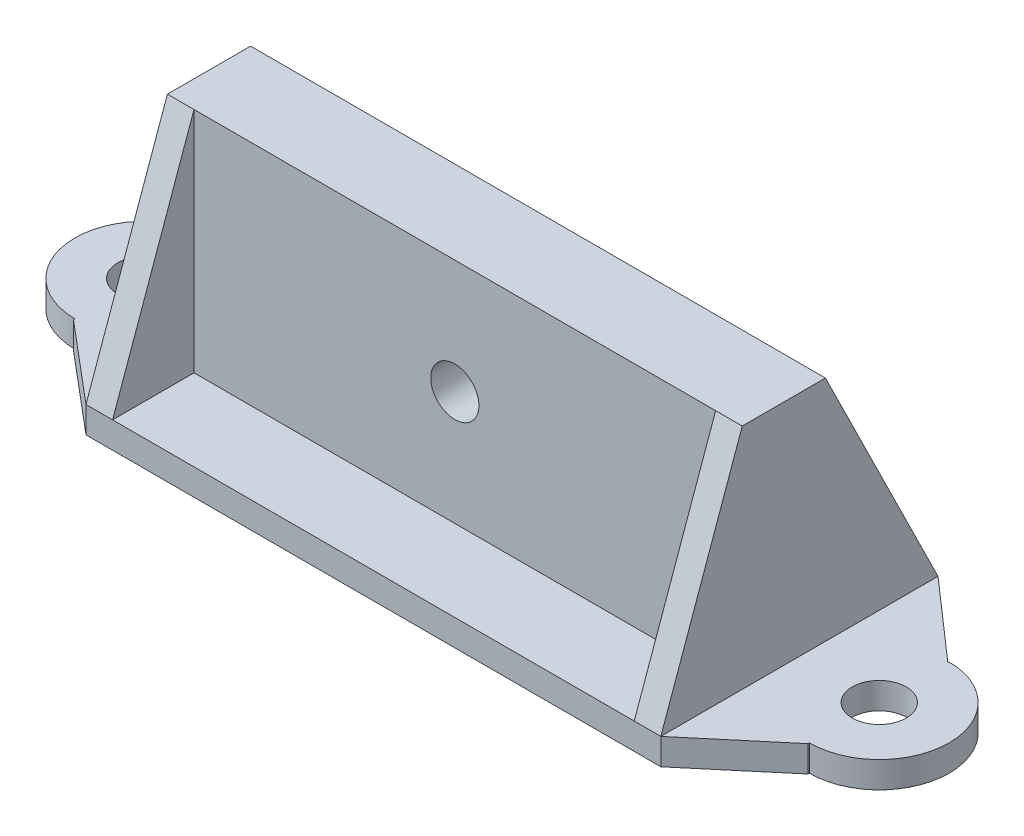
ISO-10303-21;
HEADER;
FILE_DESCRIPTION(('STEP AP214'),'2;1');
FILE_NAME('part.step','',(''),(''),'','','');
FILE_SCHEMA(('AUTOMOTIVE_DESIGN { 1 0 10303 214 1 1 1 1 }'));
ENDSEC;
DATA;
#1=APPLICATION_CONTEXT('core data for automotive mechanical design processes');
#2=APPLICATION_PROTOCOL_DEFINITION('international standard','automotive_design',2000,#1);
#3=PRODUCT_CONTEXT('',#1,'mechanical');
#4=PRODUCT('Part','Part','',(#3));
#5=PRODUCT_RELATED_PRODUCT_CATEGORY('part','',(#4));
#6=PRODUCT_DEFINITION_FORMATION('','',#4);
#7=PRODUCT_DEFINITION_CONTEXT('part definition',#1,'design');
#8=PRODUCT_DEFINITION('design','',#6,#7);
#9=PRODUCT_DEFINITION_SHAPE('','',#8);
#10=(LENGTH_UNIT() NAMED_UNIT(*) SI_UNIT(.MILLI.,.METRE.));
#11=(NAMED_UNIT(*) PLANE_ANGLE_UNIT() SI_UNIT($,.RADIAN.));
#12=(NAMED_UNIT(*) SI_UNIT($,.STERADIAN.) SOLID_ANGLE_UNIT());
#13=UNCERTAINTY_MEASURE_WITH_UNIT(LENGTH_MEASURE(1.E-05),#10,'distance_accuracy_value','');
#14=(GEOMETRIC_REPRESENTATION_CONTEXT(3) GLOBAL_UNCERTAINTY_ASSIGNED_CONTEXT((#13)) GLOBAL_UNIT_ASSIGNED_CONTEXT((#10,
#11,#12)) REPRESENTATION_CONTEXT('',''));
#15=CARTESIAN_POINT('',(0.,0.,0.));
#16=DIRECTION('',(0.,0.,1.));
#17=DIRECTION('',(1.,0.,0.));
#18=AXIS2_PLACEMENT_3D('',#15,#16,#17);
#19=CARTESIAN_POINT('',(41.475,0.,0.));
#20=DIRECTION('',(1.,0.,0.));
#21=DIRECTION('',(0.,0.,-1.));
#22=AXIS2_PLACEMENT_3D('',#19,#20,#21);
#23=PLANE('',#22);
#24=DIRECTION('',(0.,-0.941774279020095,0.33624575443592));
#25=VECTOR('',#24,1.);
#26=CARTESIAN_POINT('',(41.475,16.455,3.82));
#27=LINE('',#26,#25);
#28=CARTESIAN_POINT('',(41.475,16.455,3.82));
#29=VERTEX_POINT('',#28);
#30=CARTESIAN_POINT('',(41.475,-16.455,15.57));
#31=VERTEX_POINT('',#30);
#32=EDGE_CURVE('E358',#29,#31,#27,.T.);
#33=ORIENTED_EDGE('',*,*,#32,.T.);
#34=DIRECTION('',(0.,0.,-1.));
#35=VECTOR('',#34,1.);
#36=CARTESIAN_POINT('',(41.475,-16.455,15.57));
#37=LINE('',#36,#35);
#38=CARTESIAN_POINT('',(41.475,-16.455,-24.43));
#39=VERTEX_POINT('',#38);
#40=EDGE_CURVE('E263',#31,#39,#37,.T.);
#41=ORIENTED_EDGE('',*,*,#40,.T.);
#42=DIRECTION('',(0.,0.896650162821132,0.442739749190015));
#43=VECTOR('',#42,1.);
#44=CARTESIAN_POINT('',(41.475,16.455,-8.18));
#45=LINE('',#44,#43);
#46=CARTESIAN_POINT('',(41.475,16.455,-8.18));
#47=VERTEX_POINT('',#46);
#48=EDGE_CURVE('E299',#39,#47,#45,.T.);
#49=ORIENTED_EDGE('',*,*,#48,.T.);
#50=DIRECTION('',(0.,0.,1.));
#51=VECTOR('',#50,1.);
#52=CARTESIAN_POINT('',(41.475,16.455,0.));
#53=LINE('',#52,#51);
#54=EDGE_CURVE('E356',#47,#29,#53,.T.);
#55=ORIENTED_EDGE('',*,*,#54,.T.);
#56=EDGE_LOOP('',(#33,#41,#49,#55));
#57=FACE_BOUND('',#56,.T.);
#58=ADVANCED_FACE('F43',(#57),#23,.T.);
#59=CARTESIAN_POINT('',(0.,-16.455,0.));
#60=DIRECTION('',(0.,1.,0.));
#61=DIRECTION('',(0.,0.,1.));
#62=AXIS2_PLACEMENT_3D('',#59,#60,#61);
#63=PLANE('',#62);
#64=DIRECTION('',(1.,0.,0.));
#65=VECTOR('',#64,1.);
#66=CARTESIAN_POINT('',(41.475,-16.455,-24.43));
#67=LINE('',#66,#65);
#68=CARTESIAN_POINT('',(-37.635,-16.455,-24.43));
#69=VERTEX_POINT('',#68);
#70=CARTESIAN_POINT('',(37.635,-16.455,-24.43));
#71=VERTEX_POINT('',#70);
#72=EDGE_CURVE('E325',#69,#71,#67,.T.);
#73=ORIENTED_EDGE('',*,*,#72,.F.);
#74=DIRECTION('',(0.,0.,1.));
#75=VECTOR('',#74,1.);
#76=CARTESIAN_POINT('',(-37.635,-16.455,0.));
#77=LINE('',#76,#75);
#78=CARTESIAN_POINT('',(-37.635,-16.455,-8.18));
#79=VERTEX_POINT('',#78);
#80=EDGE_CURVE('E296',#69,#79,#77,.T.);
#81=ORIENTED_EDGE('',*,*,#80,.T.);
#82=DIRECTION('',(-1.,0.,0.));
#83=VECTOR('',#82,1.);
#84=CARTESIAN_POINT('',(0.,-16.455,-8.18));
#85=LINE('',#84,#83);
#86=CARTESIAN_POINT('',(37.635,-16.455,-8.18));
#87=VERTEX_POINT('',#86);
#88=EDGE_CURVE('E11',#87,#79,#85,.T.);
#89=ORIENTED_EDGE('',*,*,#88,.F.);
#90=DIRECTION('',(0.,0.,-1.));
#91=VECTOR('',#90,1.);
#92=CARTESIAN_POINT('',(37.635,-16.455,-24.43));
#93=LINE('',#92,#91);
#94=EDGE_CURVE('E303',#87,#71,#93,.T.);
#95=ORIENTED_EDGE('',*,*,#94,.T.);
#96=EDGE_LOOP('',(#73,#81,#89,#95));
#97=FACE_BOUND('',#96,.T.);
#98=ADVANCED_FACE('F441',(#97),#63,.T.);
#99=CARTESIAN_POINT('',(-41.475,-17.345,-8.18));
#100=DIRECTION('',(0.,0.,-1.));
#101=DIRECTION('',(-1.,0.,0.));
#102=AXIS2_PLACEMENT_3D('',#99,#100,#101);
#103=PLANE('',#102);
#104=CARTESIAN_POINT('',(0.,0.,-8.18));
#105=DIRECTION('',(0.,0.,-1.));
#106=DIRECTION('',(-1.,0.,0.));
#107=AXIS2_PLACEMENT_3D('',#104,#105,#106);
#108=CIRCLE('',#107,3.475);
#109=CARTESIAN_POINT('',(-3.475,0.,-8.18));
#110=VERTEX_POINT('',#109);
#111=EDGE_CURVE('E47',#110,#110,#108,.T.);
#112=ORIENTED_EDGE('',*,*,#111,.F.);
#113=EDGE_LOOP('',(#112));
#114=FACE_BOUND('',#113,.T.);
#115=ORIENTED_EDGE('',*,*,#88,.T.);
#116=DIRECTION('',(0.,1.,0.));
#117=VECTOR('',#116,1.);
#118=CARTESIAN_POINT('',(-37.635,16.455,-8.18));
#119=LINE('',#118,#117);
#120=CARTESIAN_POINT('',(-37.635,16.455,-8.18));
#121=VERTEX_POINT('',#120);
#122=EDGE_CURVE('E288',#79,#121,#119,.T.);
#123=ORIENTED_EDGE('',*,*,#122,.T.);
#124=DIRECTION('',(-1.,0.,0.));
#125=VECTOR('',#124,1.);
#126=CARTESIAN_POINT('',(-41.475,16.455,-8.18));
#127=LINE('',#126,#125);
#128=CARTESIAN_POINT('',(37.635,16.455,-8.18));
#129=VERTEX_POINT('',#128);
#130=EDGE_CURVE('E320',#129,#121,#127,.T.);
#131=ORIENTED_EDGE('',*,*,#130,.F.);
#132=DIRECTION('',(0.,-1.,0.));
#133=VECTOR('',#132,1.);
#134=CARTESIAN_POINT('',(37.635,-16.455,-8.18));
#135=LINE('',#134,#133);
#136=EDGE_CURVE('E300',#129,#87,#135,.T.);
#137=ORIENTED_EDGE('',*,*,#136,.T.);
#138=EDGE_LOOP('',(#115,#123,#131,#137));
#139=FACE_BOUND('',#138,.T.);
#140=ADVANCED_FACE('F432',(#114,#139),#103,.T.);
#141=CARTESIAN_POINT('',(-37.635,16.455,3.82));
#142=DIRECTION('',(0.,-1.,0.));
#143=DIRECTION('',(0.,0.,-1.));
#144=AXIS2_PLACEMENT_3D('',#141,#142,#143);
#145=PLANE('',#144);
#146=ORIENTED_EDGE('',*,*,#54,.F.);
#147=EDGE_CURVE('E316',#47,#129,#127,.T.);
#148=ORIENTED_EDGE('',*,*,#147,.T.);
#149=ORIENTED_EDGE('',*,*,#130,.T.);
#150=DIRECTION('',(-1.,0.,0.));
#151=VECTOR('',#150,1.);
#152=CARTESIAN_POINT('',(-37.635,16.455,-8.18));
#153=LINE('',#152,#151);
#154=CARTESIAN_POINT('',(-41.475,16.455,-8.18));
#155=VERTEX_POINT('',#154);
#156=EDGE_CURVE('E291',#121,#155,#153,.T.);
#157=ORIENTED_EDGE('',*,*,#156,.T.);
#158=DIRECTION('',(0.,0.,-1.));
#159=VECTOR('',#158,1.);
#160=CARTESIAN_POINT('',(-41.475,16.455,0.));
#161=LINE('',#160,#159);
#162=CARTESIAN_POINT('',(-41.475,16.455,3.82));
#163=VERTEX_POINT('',#162);
#164=EDGE_CURVE('E344',#163,#155,#161,.T.);
#165=ORIENTED_EDGE('',*,*,#164,.F.);
#166=DIRECTION('',(1.,0.,0.));
#167=VECTOR('',#166,1.);
#168=CARTESIAN_POINT('',(-41.475,16.455,3.82));
#169=LINE('',#168,#167);
#170=CARTESIAN_POINT('',(-37.635,16.455,3.82));
#171=VERTEX_POINT('',#170);
#172=EDGE_CURVE('E347',#163,#171,#169,.T.);
#173=ORIENTED_EDGE('',*,*,#172,.T.);
#174=DIRECTION('',(-1.,0.,0.));
#175=VECTOR('',#174,1.);
#176=CARTESIAN_POINT('',(-37.635,16.455,3.82));
#177=LINE('',#176,#175);
#178=CARTESIAN_POINT('',(37.635,16.455,3.82));
#179=VERTEX_POINT('',#178);
#180=EDGE_CURVE('E375',#179,#171,#177,.T.);
#181=ORIENTED_EDGE('',*,*,#180,.F.);
#182=DIRECTION('',(-1.,0.,0.));
#183=VECTOR('',#182,1.);
#184=CARTESIAN_POINT('',(41.475,16.455,3.82));
#185=LINE('',#184,#183);
#186=EDGE_CURVE('E369',#29,#179,#185,.T.);
#187=ORIENTED_EDGE('',*,*,#186,.F.);
#188=EDGE_LOOP('',(#146,#148,#149,#157,#165,#173,#181,#187));
#189=FACE_BOUND('',#188,.T.);
#190=ADVANCED_FACE('F45',(#189),#145,.F.);
#191=CARTESIAN_POINT('',(0.,0.,3.82));
#192=DIRECTION('',(0.,0.,-1.));
#193=DIRECTION('',(-1.,0.,0.));
#194=AXIS2_PLACEMENT_3D('',#191,#192,#193);
#195=PLANE('',#194);
#196=CARTESIAN_POINT('',(0.,0.,3.82));
#197=DIRECTION('',(0.,0.,1.));
#198=DIRECTION('',(1.,0.,0.));
#199=AXIS2_PLACEMENT_3D('',#196,#197,#198);
#200=CIRCLE('',#199,3.475);
#201=CARTESIAN_POINT('',(3.475,0.,3.82));
#202=VERTEX_POINT('',#201);
#203=EDGE_CURVE('E313',#202,#202,#200,.T.);
#204=ORIENTED_EDGE('',*,*,#203,.F.);
#205=EDGE_LOOP('',(#204));
#206=FACE_BOUND('',#205,.T.);
#207=DIRECTION('',(0.,1.,0.));
#208=VECTOR('',#207,1.);
#209=CARTESIAN_POINT('',(37.635,-16.455,3.82));
#210=LINE('',#209,#208);
#211=CARTESIAN_POINT('',(37.635,-16.455,3.82));
#212=VERTEX_POINT('',#211);
#213=EDGE_CURVE('E372',#212,#179,#210,.T.);
#214=ORIENTED_EDGE('',*,*,#213,.T.);
#215=ORIENTED_EDGE('',*,*,#180,.T.);
#216=DIRECTION('',(0.,-1.,0.));
#217=VECTOR('',#216,1.);
#218=CARTESIAN_POINT('',(-37.635,-16.455,3.82));
#219=LINE('',#218,#217);
#220=CARTESIAN_POINT('',(-37.635,-16.455,3.82));
#221=VERTEX_POINT('',#220);
#222=EDGE_CURVE('E378',#171,#221,#219,.T.);
#223=ORIENTED_EDGE('',*,*,#222,.T.);
#224=DIRECTION('',(1.,0.,0.));
#225=VECTOR('',#224,1.);
#226=CARTESIAN_POINT('',(-37.635,-16.455,3.82));
#227=LINE('',#226,#225);
#228=EDGE_CURVE('E52',#221,#212,#227,.T.);
#229=ORIENTED_EDGE('',*,*,#228,.T.);
#230=EDGE_LOOP('',(#214,#215,#223,#229));
#231=FACE_BOUND('',#230,.T.);
#232=ADVANCED_FACE('F383',(#206,#231),#195,.F.);
#233=CARTESIAN_POINT('',(41.475,16.455,3.82));
#234=DIRECTION('',(0.,-0.33624575443592,-0.941774279020095));
#235=DIRECTION('',(0.,0.941774279020095,-0.33624575443592));
#236=AXIS2_PLACEMENT_3D('',#233,#234,#235);
#237=PLANE('',#236);
#238=DIRECTION('',(0.,-0.941774279020095,0.33624575443592));
#239=VECTOR('',#238,1.);
#240=CARTESIAN_POINT('',(37.635,16.455,3.82));
#241=LINE('',#240,#239);
#242=CARTESIAN_POINT('',(37.635,-16.455,15.57));
#243=VERTEX_POINT('',#242);
#244=EDGE_CURVE('E359',#179,#243,#241,.T.);
#245=ORIENTED_EDGE('',*,*,#244,.T.);
#246=DIRECTION('',(-1.,0.,0.));
#247=VECTOR('',#246,1.);
#248=CARTESIAN_POINT('',(41.475,-16.455,15.57));
#249=LINE('',#248,#247);
#250=EDGE_CURVE('E362',#31,#243,#249,.T.);
#251=ORIENTED_EDGE('',*,*,#250,.F.);
#252=ORIENTED_EDGE('',*,*,#32,.F.);
#253=ORIENTED_EDGE('',*,*,#186,.T.);
#254=EDGE_LOOP('',(#245,#251,#252,#253));
#255=FACE_BOUND('',#254,.T.);
#256=ADVANCED_FACE('F391',(#255),#237,.F.);
#257=CARTESIAN_POINT('',(37.635,0.,0.));
#258=DIRECTION('',(1.,0.,0.));
#259=DIRECTION('',(0.,0.,-1.));
#260=AXIS2_PLACEMENT_3D('',#257,#258,#259);
#261=PLANE('',#260);
#262=ORIENTED_EDGE('',*,*,#213,.F.);
#263=DIRECTION('',(0.,0.,-1.));
#264=VECTOR('',#263,1.);
#265=CARTESIAN_POINT('',(37.635,-16.455,3.82));
#266=LINE('',#265,#264);
#267=EDGE_CURVE('E355',#243,#212,#266,.T.);
#268=ORIENTED_EDGE('',*,*,#267,.F.);
#269=ORIENTED_EDGE('',*,*,#244,.F.);
#270=EDGE_LOOP('',(#262,#268,#269));
#271=FACE_BOUND('',#270,.T.);
#272=ADVANCED_FACE('F388',(#271),#261,.F.);
#273=CARTESIAN_POINT('',(-37.635,0.,0.));
#274=DIRECTION('',(1.,0.,0.));
#275=DIRECTION('',(0.,0.,-1.));
#276=AXIS2_PLACEMENT_3D('',#273,#274,#275);
#277=PLANE('',#276);
#278=ORIENTED_EDGE('',*,*,#222,.F.);
#279=DIRECTION('',(0.,0.941774279020095,-0.33624575443592));
#280=VECTOR('',#279,1.);
#281=CARTESIAN_POINT('',(-37.635,16.455,3.82));
#282=LINE('',#281,#280);
#283=CARTESIAN_POINT('',(-37.635,-16.455,15.57));
#284=VERTEX_POINT('',#283);
#285=EDGE_CURVE('E341',#284,#171,#282,.T.);
#286=ORIENTED_EDGE('',*,*,#285,.F.);
#287=DIRECTION('',(0.,0.,1.));
#288=VECTOR('',#287,1.);
#289=CARTESIAN_POINT('',(-37.635,-16.455,3.82));
#290=LINE('',#289,#288);
#291=EDGE_CURVE('E67',#221,#284,#290,.T.);
#292=ORIENTED_EDGE('',*,*,#291,.F.);
#293=EDGE_LOOP('',(#278,#286,#292));
#294=FACE_BOUND('',#293,.T.);
#295=ADVANCED_FACE('F403',(#294),#277,.T.);
#296=CARTESIAN_POINT('',(-41.475,16.455,3.82));
#297=DIRECTION('',(0.,-0.33624575443592,-0.941774279020095));
#298=DIRECTION('',(0.,0.941774279020095,-0.33624575443592));
#299=AXIS2_PLACEMENT_3D('',#296,#297,#298);
#300=PLANE('',#299);
#301=ORIENTED_EDGE('',*,*,#285,.T.);
#302=ORIENTED_EDGE('',*,*,#172,.F.);
#303=DIRECTION('',(0.,0.941774279020095,-0.33624575443592));
#304=VECTOR('',#303,1.);
#305=CARTESIAN_POINT('',(-41.475,16.455,3.82));
#306=LINE('',#305,#304);
#307=CARTESIAN_POINT('',(-41.475,-16.455,15.57));
#308=VERTEX_POINT('',#307);
#309=EDGE_CURVE('E342',#308,#163,#306,.T.);
#310=ORIENTED_EDGE('',*,*,#309,.F.);
#311=DIRECTION('',(1.,0.,0.));
#312=VECTOR('',#311,1.);
#313=CARTESIAN_POINT('',(-41.475,-16.455,15.57));
#314=LINE('',#313,#312);
#315=EDGE_CURVE('E353',#308,#284,#314,.T.);
#316=ORIENTED_EDGE('',*,*,#315,.T.);
#317=EDGE_LOOP('',(#301,#302,#310,#316));
#318=FACE_BOUND('',#317,.T.);
#319=ADVANCED_FACE('F401',(#318),#300,.F.);
#320=CARTESIAN_POINT('',(-41.475,0.,0.));
#321=DIRECTION('',(1.,0.,0.));
#322=DIRECTION('',(0.,0.,-1.));
#323=AXIS2_PLACEMENT_3D('',#320,#321,#322);
#324=PLANE('',#323);
#325=DIRECTION('',(0.,-0.896650162821132,-0.442739749190015));
#326=VECTOR('',#325,1.);
#327=CARTESIAN_POINT('',(-41.475,-16.455,-24.43));
#328=LINE('',#327,#326);
#329=CARTESIAN_POINT('',(-41.475,-16.455,-24.43));
#330=VERTEX_POINT('',#329);
#331=EDGE_CURVE('E281',#155,#330,#328,.T.);
#332=ORIENTED_EDGE('',*,*,#331,.T.);
#333=DIRECTION('',(0.,0.,1.));
#334=VECTOR('',#333,1.);
#335=CARTESIAN_POINT('',(-41.475,-16.455,15.57));
#336=LINE('',#335,#334);
#337=EDGE_CURVE('E225',#330,#308,#336,.T.);
#338=ORIENTED_EDGE('',*,*,#337,.T.);
#339=ORIENTED_EDGE('',*,*,#309,.T.);
#340=ORIENTED_EDGE('',*,*,#164,.T.);
#341=EDGE_LOOP('',(#332,#338,#339,#340));
#342=FACE_BOUND('',#341,.T.);
#343=ADVANCED_FACE('F715',(#342),#324,.F.);
#344=CARTESIAN_POINT('',(-41.475,-20.255,15.57));
#345=DIRECTION('',(0.,0.,-1.));
#346=DIRECTION('',(-1.,0.,0.));
#347=AXIS2_PLACEMENT_3D('',#344,#345,#346);
#348=PLANE('',#347);
#349=ORIENTED_EDGE('',*,*,#250,.T.);
#350=DIRECTION('',(-1.,0.,0.));
#351=VECTOR('',#350,1.);
#352=CARTESIAN_POINT('',(-41.475,-16.455,15.57));
#353=LINE('',#352,#351);
#354=EDGE_CURVE('E331',#243,#284,#353,.T.);
#355=ORIENTED_EDGE('',*,*,#354,.T.);
#356=ORIENTED_EDGE('',*,*,#315,.F.);
#357=DIRECTION('',(0.,1.,0.));
#358=VECTOR('',#357,1.);
#359=CARTESIAN_POINT('',(-41.475,-20.255,15.57));
#360=LINE('',#359,#358);
#361=CARTESIAN_POINT('',(-41.475,-20.255,15.57));
#362=VERTEX_POINT('',#361);
#363=EDGE_CURVE('E334',#362,#308,#360,.T.);
#364=ORIENTED_EDGE('',*,*,#363,.F.);
#365=DIRECTION('',(-1.,0.,0.));
#366=VECTOR('',#365,1.);
#367=CARTESIAN_POINT('',(-41.475,-20.255,15.57));
#368=LINE('',#367,#366);
#369=CARTESIAN_POINT('',(41.475,-20.255,15.57));
#370=VERTEX_POINT('',#369);
#371=EDGE_CURVE('E209',#370,#362,#368,.T.);
#372=ORIENTED_EDGE('',*,*,#371,.F.);
#373=DIRECTION('',(0.,1.,0.));
#374=VECTOR('',#373,1.);
#375=CARTESIAN_POINT('',(41.475,-20.255,15.57));
#376=LINE('',#375,#374);
#377=EDGE_CURVE('E338',#370,#31,#376,.T.);
#378=ORIENTED_EDGE('',*,*,#377,.T.);
#379=EDGE_LOOP('',(#349,#355,#356,#364,#372,#378));
#380=FACE_BOUND('',#379,.T.);
#381=ADVANCED_FACE('F405',(#380),#348,.F.);
#382=CARTESIAN_POINT('',(0.,-20.255,0.));
#383=DIRECTION('',(0.,1.,0.));
#384=DIRECTION('',(0.,0.,1.));
#385=AXIS2_PLACEMENT_3D('',#382,#383,#384);
#386=PLANE('',#385);
#387=ORIENTED_EDGE('',*,*,#371,.T.);
#388=DIRECTION('',(-0.764594460814203,0.,-0.644511683751535));
#389=VECTOR('',#388,1.);
#390=CARTESIAN_POINT('',(-52.9957615697479,-20.255,5.85862250779168));
#391=LINE('',#390,#389);
#392=CARTESIAN_POINT('',(-52.9957615697479,-20.255,5.85862250779168));
#393=VERTEX_POINT('',#392);
#394=EDGE_CURVE('E187',#362,#393,#391,.T.);
#395=ORIENTED_EDGE('',*,*,#394,.T.);
#396=DIRECTION('',(0.,0.,-1.));
#397=VECTOR('',#396,1.);
#398=CARTESIAN_POINT('',(-52.9957615697479,-20.255,5.66266423903836));
#399=LINE('',#398,#397);
#400=CARTESIAN_POINT('',(-52.9957615697479,-20.255,5.66266423903836));
#401=VERTEX_POINT('',#400);
#402=EDGE_CURVE('E196',#393,#401,#399,.T.);
#403=ORIENTED_EDGE('',*,*,#402,.T.);
#404=CARTESIAN_POINT('',(-52.9957615697479,-20.255,-4.43));
#405=DIRECTION('',(0.,-1.,0.));
#406=DIRECTION('',(0.,0.,1.));
#407=AXIS2_PLACEMENT_3D('',#404,#405,#406);
#408=CIRCLE('',#407,10.0926642390384);
#409=CARTESIAN_POINT('',(-52.9957615697479,-20.255,-14.5226642390384));
#410=VERTEX_POINT('',#409);
#411=EDGE_CURVE('E203',#401,#410,#408,.T.);
#412=ORIENTED_EDGE('',*,*,#411,.T.);
#413=DIRECTION('',(0.,0.,1.));
#414=VECTOR('',#413,1.);
#415=CARTESIAN_POINT('',(-52.9957615697479,-20.255,-14.5226642390384));
#416=LINE('',#415,#414);
#417=CARTESIAN_POINT('',(-52.9957615697479,-20.255,-14.326705970285));
#418=VERTEX_POINT('',#417);
#419=EDGE_CURVE('E215',#410,#418,#416,.T.);
#420=ORIENTED_EDGE('',*,*,#419,.T.);
#421=DIRECTION('',(0.751844424010848,0.,-0.6593405509172));
#422=VECTOR('',#421,1.);
#423=CARTESIAN_POINT('',(-52.9957615697479,-20.255,-14.326705970285));
#424=LINE('',#423,#422);
#425=CARTESIAN_POINT('',(-41.475,-20.255,-24.43));
#426=VERTEX_POINT('',#425);
#427=EDGE_CURVE('E211',#418,#426,#424,.T.);
#428=ORIENTED_EDGE('',*,*,#427,.T.);
#429=DIRECTION('',(1.,0.,0.));
#430=VECTOR('',#429,1.);
#431=CARTESIAN_POINT('',(41.475,-20.255,-24.43));
#432=LINE('',#431,#430);
#433=CARTESIAN_POINT('',(41.475,-20.255,-24.43));
#434=VERTEX_POINT('',#433);
#435=EDGE_CURVE('E319',#426,#434,#432,.T.);
#436=ORIENTED_EDGE('',*,*,#435,.T.);
#437=DIRECTION('',(0.751844424010848,0.,0.6593405509172));
#438=VECTOR('',#437,1.);
#439=CARTESIAN_POINT('',(52.9957615697479,-20.255,-14.326705970285));
#440=LINE('',#439,#438);
#441=CARTESIAN_POINT('',(52.9957615697479,-20.255,-14.326705970285));
#442=VERTEX_POINT('',#441);
#443=EDGE_CURVE('E245',#434,#442,#440,.T.);
#444=ORIENTED_EDGE('',*,*,#443,.T.);
#445=DIRECTION('',(0.,0.,-1.));
#446=VECTOR('',#445,1.);
#447=CARTESIAN_POINT('',(52.9957615697479,-20.255,-14.5226642390384));
#448=LINE('',#447,#446);
#449=CARTESIAN_POINT('',(52.9957615697479,-20.255,-14.5226642390384));
#450=VERTEX_POINT('',#449);
#451=EDGE_CURVE('E269',#442,#450,#448,.T.);
#452=ORIENTED_EDGE('',*,*,#451,.T.);
#453=CARTESIAN_POINT('',(52.9957615697479,-20.255,-4.43));
#454=DIRECTION('',(0.,-1.,0.));
#455=DIRECTION('',(0.,0.,-1.));
#456=AXIS2_PLACEMENT_3D('',#453,#454,#455);
#457=CIRCLE('',#456,10.0926642390384);
#458=CARTESIAN_POINT('',(52.9957615697479,-20.255,5.66266423903836));
#459=VERTEX_POINT('',#458);
#460=EDGE_CURVE('E272',#450,#459,#457,.T.);
#461=ORIENTED_EDGE('',*,*,#460,.T.);
#462=DIRECTION('',(0.,0.,1.));
#463=VECTOR('',#462,1.);
#464=CARTESIAN_POINT('',(52.9957615697479,-20.255,5.66266423903836));
#465=LINE('',#464,#463);
#466=CARTESIAN_POINT('',(52.9957615697479,-20.255,5.85862250779168));
#467=VERTEX_POINT('',#466);
#468=EDGE_CURVE('E275',#459,#467,#465,.T.);
#469=ORIENTED_EDGE('',*,*,#468,.T.);
#470=DIRECTION('',(-0.764594460814203,0.,0.644511683751535));
#471=VECTOR('',#470,1.);
#472=CARTESIAN_POINT('',(52.9957615697479,-20.255,5.85862250779168));
#473=LINE('',#472,#471);
#474=EDGE_CURVE('E252',#467,#370,#473,.T.);
#475=ORIENTED_EDGE('',*,*,#474,.T.);
#476=EDGE_LOOP('',(#387,#395,#403,#412,#420,#428,#436,#444,#452,#461,#469,#475));
#477=FACE_BOUND('',#476,.T.);
#478=CARTESIAN_POINT('',(52.9957615697479,-20.255,-4.43));
#479=DIRECTION('',(0.,-1.,0.));
#480=DIRECTION('',(0.,0.,-1.));
#481=AXIS2_PLACEMENT_3D('',#478,#479,#480);
#482=CIRCLE('',#481,3.9);
#483=CARTESIAN_POINT('',(52.9957615697479,-20.255,-8.33));
#484=VERTEX_POINT('',#483);
#485=EDGE_CURVE('E239',#484,#484,#482,.T.);
#486=ORIENTED_EDGE('',*,*,#485,.F.);
#487=EDGE_LOOP('',(#486));
#488=FACE_BOUND('',#487,.T.);
#489=CARTESIAN_POINT('',(-52.9957615697479,-20.255,-4.43));
#490=DIRECTION('',(0.,-1.,0.));
#491=DIRECTION('',(0.,0.,1.));
#492=AXIS2_PLACEMENT_3D('',#489,#490,#491);
#493=CIRCLE('',#492,3.9);
#494=CARTESIAN_POINT('',(-52.9957615697479,-20.255,-8.33));
#495=VERTEX_POINT('',#494);
#496=EDGE_CURVE('E236',#495,#495,#493,.T.);
#497=ORIENTED_EDGE('',*,*,#496,.F.);
#498=EDGE_LOOP('',(#497));
#499=FACE_BOUND('',#498,.T.);
#500=ADVANCED_FACE('F205',(#477,#488,#499),#386,.F.);
#501=CARTESIAN_POINT('',(0.,-16.455,0.));
#502=DIRECTION('',(0.,1.,0.));
#503=DIRECTION('',(0.,0.,1.));
#504=AXIS2_PLACEMENT_3D('',#501,#502,#503);
#505=PLANE('',#504);
#506=ORIENTED_EDGE('',*,*,#354,.F.);
#507=ORIENTED_EDGE('',*,*,#267,.T.);
#508=ORIENTED_EDGE('',*,*,#228,.F.);
#509=ORIENTED_EDGE('',*,*,#291,.T.);
#510=EDGE_LOOP('',(#506,#507,#508,#509));
#511=FACE_BOUND('',#510,.T.);
#512=ADVANCED_FACE('F386',(#511),#505,.T.);
#513=CARTESIAN_POINT('',(41.475,-16.455,-24.43));
#514=DIRECTION('',(0.,0.,-1.));
#515=DIRECTION('',(-1.,0.,0.));
#516=AXIS2_PLACEMENT_3D('',#513,#514,#515);
#517=PLANE('',#516);
#518=ORIENTED_EDGE('',*,*,#435,.F.);
#519=DIRECTION('',(0.,-1.,0.));
#520=VECTOR('',#519,1.);
#521=CARTESIAN_POINT('',(-41.475,-16.455,-24.43));
#522=LINE('',#521,#520);
#523=EDGE_CURVE('E324',#330,#426,#522,.T.);
#524=ORIENTED_EDGE('',*,*,#523,.F.);
#525=EDGE_CURVE('E321',#330,#69,#67,.T.);
#526=ORIENTED_EDGE('',*,*,#525,.T.);
#527=ORIENTED_EDGE('',*,*,#72,.T.);
#528=DIRECTION('',(1.,0.,0.));
#529=VECTOR('',#528,1.);
#530=CARTESIAN_POINT('',(37.635,-16.455,-24.43));
#531=LINE('',#530,#529);
#532=EDGE_CURVE('E309',#71,#39,#531,.T.);
#533=ORIENTED_EDGE('',*,*,#532,.T.);
#534=DIRECTION('',(0.,-1.,0.));
#535=VECTOR('',#534,1.);
#536=CARTESIAN_POINT('',(41.475,-16.455,-24.43));
#537=LINE('',#536,#535);
#538=EDGE_CURVE('E328',#39,#434,#537,.T.);
#539=ORIENTED_EDGE('',*,*,#538,.T.);
#540=EDGE_LOOP('',(#518,#524,#526,#527,#533,#539));
#541=FACE_BOUND('',#540,.T.);
#542=ADVANCED_FACE('F466',(#541),#517,.T.);
#543=CARTESIAN_POINT('',(0.,0.,-29.98));
#544=DIRECTION('',(0.,0.,1.));
#545=DIRECTION('',(1.,0.,0.));
#546=AXIS2_PLACEMENT_3D('',#543,#544,#545);
#547=CYLINDRICAL_SURFACE('',#546,3.475);
#548=ORIENTED_EDGE('',*,*,#111,.T.);
#549=EDGE_LOOP('',(#548));
#550=FACE_BOUND('',#549,.T.);
#551=ORIENTED_EDGE('',*,*,#203,.T.);
#552=EDGE_LOOP('',(#551));
#553=FACE_BOUND('',#552,.T.);
#554=ADVANCED_FACE('F437',(#550,#553),#547,.F.);
#555=CARTESIAN_POINT('',(37.635,16.455,-8.18));
#556=DIRECTION('',(0.,0.442739749190015,-0.896650162821132));
#557=DIRECTION('',(0.,0.896650162821132,0.442739749190015));
#558=AXIS2_PLACEMENT_3D('',#555,#556,#557);
#559=PLANE('',#558);
#560=ORIENTED_EDGE('',*,*,#48,.F.);
#561=ORIENTED_EDGE('',*,*,#532,.F.);
#562=DIRECTION('',(0.,0.896650162821132,0.442739749190015));
#563=VECTOR('',#562,1.);
#564=CARTESIAN_POINT('',(37.635,16.455,-8.18));
#565=LINE('',#564,#563);
#566=EDGE_CURVE('E306',#71,#129,#565,.T.);
#567=ORIENTED_EDGE('',*,*,#566,.T.);
#568=ORIENTED_EDGE('',*,*,#147,.F.);
#569=EDGE_LOOP('',(#560,#561,#567,#568));
#570=FACE_BOUND('',#569,.T.);
#571=ADVANCED_FACE('F427',(#570),#559,.T.);
#572=CARTESIAN_POINT('',(37.635,0.,0.));
#573=DIRECTION('',(1.,0.,0.));
#574=DIRECTION('',(0.,0.,-1.));
#575=AXIS2_PLACEMENT_3D('',#572,#573,#574);
#576=PLANE('',#575);
#577=ORIENTED_EDGE('',*,*,#136,.F.);
#578=ORIENTED_EDGE('',*,*,#566,.F.);
#579=ORIENTED_EDGE('',*,*,#94,.F.);
#580=EDGE_LOOP('',(#577,#578,#579));
#581=FACE_BOUND('',#580,.T.);
#582=ADVANCED_FACE('F471',(#581),#576,.F.);
#583=CARTESIAN_POINT('',(-37.635,-16.455,-24.43));
#584=DIRECTION('',(0.,0.442739749190015,-0.896650162821132));
#585=DIRECTION('',(0.,0.896650162821132,0.442739749190015));
#586=AXIS2_PLACEMENT_3D('',#583,#584,#585);
#587=PLANE('',#586);
#588=ORIENTED_EDGE('',*,*,#331,.F.);
#589=ORIENTED_EDGE('',*,*,#156,.F.);
#590=DIRECTION('',(0.,-0.896650162821132,-0.442739749190015));
#591=VECTOR('',#590,1.);
#592=CARTESIAN_POINT('',(-37.635,-16.455,-24.43));
#593=LINE('',#592,#591);
#594=EDGE_CURVE('E59',#121,#69,#593,.T.);
#595=ORIENTED_EDGE('',*,*,#594,.T.);
#596=ORIENTED_EDGE('',*,*,#525,.F.);
#597=EDGE_LOOP('',(#588,#589,#595,#596));
#598=FACE_BOUND('',#597,.T.);
#599=ADVANCED_FACE('F478',(#598),#587,.T.);
#600=CARTESIAN_POINT('',(-37.635,0.,0.));
#601=DIRECTION('',(-1.,0.,0.));
#602=DIRECTION('',(0.,0.,1.));
#603=AXIS2_PLACEMENT_3D('',#600,#601,#602);
#604=PLANE('',#603);
#605=ORIENTED_EDGE('',*,*,#80,.F.);
#606=ORIENTED_EDGE('',*,*,#594,.F.);
#607=ORIENTED_EDGE('',*,*,#122,.F.);
#608=EDGE_LOOP('',(#605,#606,#607));
#609=FACE_BOUND('',#608,.T.);
#610=ADVANCED_FACE('F481',(#609),#604,.F.);
#611=CARTESIAN_POINT('',(52.9957615697479,-16.455,-14.326705970285));
#612=DIRECTION('',(0.6593405509172,0.,-0.751844424010848));
#613=DIRECTION('',(-0.751844424010848,0.,-0.6593405509172));
#614=AXIS2_PLACEMENT_3D('',#611,#612,#613);
#615=PLANE('',#614);
#616=ORIENTED_EDGE('',*,*,#443,.F.);
#617=ORIENTED_EDGE('',*,*,#538,.F.);
#618=DIRECTION('',(0.751844424010848,0.,0.6593405509172));
#619=VECTOR('',#618,1.);
#620=CARTESIAN_POINT('',(52.9957615697479,-16.455,-14.326705970285));
#621=LINE('',#620,#619);
#622=CARTESIAN_POINT('',(52.9957615697479,-16.455,-14.326705970285));
#623=VERTEX_POINT('',#622);
#624=EDGE_CURVE('E248',#39,#623,#621,.T.);
#625=ORIENTED_EDGE('',*,*,#624,.T.);
#626=DIRECTION('',(0.,-1.,0.));
#627=VECTOR('',#626,1.);
#628=CARTESIAN_POINT('',(52.9957615697479,-16.455,-14.326705970285));
#629=LINE('',#628,#627);
#630=EDGE_CURVE('E266',#623,#442,#629,.T.);
#631=ORIENTED_EDGE('',*,*,#630,.T.);
#632=EDGE_LOOP('',(#616,#617,#625,#631));
#633=FACE_BOUND('',#632,.T.);
#634=ADVANCED_FACE('F484',(#633),#615,.T.);
#635=CARTESIAN_POINT('',(52.9957615697479,-16.455,5.85862250779168));
#636=DIRECTION('',(0.644511683751535,0.,0.764594460814203));
#637=DIRECTION('',(0.764594460814203,0.,-0.644511683751535));
#638=AXIS2_PLACEMENT_3D('',#635,#636,#637);
#639=PLANE('',#638);
#640=ORIENTED_EDGE('',*,*,#474,.F.);
#641=DIRECTION('',(0.,-1.,0.));
#642=VECTOR('',#641,1.);
#643=CARTESIAN_POINT('',(52.9957615697479,-16.455,5.85862250779168));
#644=LINE('',#643,#642);
#645=CARTESIAN_POINT('',(52.9957615697479,-16.455,5.85862250779168));
#646=VERTEX_POINT('',#645);
#647=EDGE_CURVE('E279',#646,#467,#644,.T.);
#648=ORIENTED_EDGE('',*,*,#647,.F.);
#649=DIRECTION('',(-0.764594460814203,0.,0.644511683751535));
#650=VECTOR('',#649,1.);
#651=CARTESIAN_POINT('',(52.9957615697479,-16.455,5.85862250779168));
#652=LINE('',#651,#650);
#653=EDGE_CURVE('E261',#646,#31,#652,.T.);
#654=ORIENTED_EDGE('',*,*,#653,.T.);
#655=ORIENTED_EDGE('',*,*,#377,.F.);
#656=EDGE_LOOP('',(#640,#648,#654,#655));
#657=FACE_BOUND('',#656,.T.);
#658=ADVANCED_FACE('F408',(#657),#639,.T.);
#659=CARTESIAN_POINT('',(52.9957615697479,-16.455,5.66266423903836));
#660=DIRECTION('',(1.,0.,0.));
#661=DIRECTION('',(0.,0.,-1.));
#662=AXIS2_PLACEMENT_3D('',#659,#660,#661);
#663=PLANE('',#662);
#664=ORIENTED_EDGE('',*,*,#468,.F.);
#665=DIRECTION('',(0.,-1.,0.));
#666=VECTOR('',#665,1.);
#667=CARTESIAN_POINT('',(52.9957615697479,-16.455,5.66266423903836));
#668=LINE('',#667,#666);
#669=CARTESIAN_POINT('',(52.9957615697479,-16.455,5.66266423903836));
#670=VERTEX_POINT('',#669);
#671=EDGE_CURVE('E282',#670,#459,#668,.T.);
#672=ORIENTED_EDGE('',*,*,#671,.F.);
#673=DIRECTION('',(0.,0.,1.));
#674=VECTOR('',#673,1.);
#675=CARTESIAN_POINT('',(52.9957615697479,-16.455,5.66266423903836));
#676=LINE('',#675,#674);
#677=EDGE_CURVE('E258',#670,#646,#676,.T.);
#678=ORIENTED_EDGE('',*,*,#677,.T.);
#679=ORIENTED_EDGE('',*,*,#647,.T.);
#680=EDGE_LOOP('',(#664,#672,#678,#679));
#681=FACE_BOUND('',#680,.T.);
#682=ADVANCED_FACE('F414',(#681),#663,.T.);
#683=CARTESIAN_POINT('',(52.9957615697479,-16.455,-4.43));
#684=DIRECTION('',(0.,-1.,0.));
#685=DIRECTION('',(0.,0.,-1.));
#686=AXIS2_PLACEMENT_3D('',#683,#684,#685);
#687=CYLINDRICAL_SURFACE('',#686,10.0926642390384);
#688=ORIENTED_EDGE('',*,*,#460,.F.);
#689=DIRECTION('',(0.,-1.,0.));
#690=VECTOR('',#689,1.);
#691=CARTESIAN_POINT('',(52.9957615697479,-16.455,-14.5226642390384));
#692=LINE('',#691,#690);
#693=CARTESIAN_POINT('',(52.9957615697479,-16.455,-14.5226642390384));
#694=VERTEX_POINT('',#693);
#695=EDGE_CURVE('E284',#694,#450,#692,.T.);
#696=ORIENTED_EDGE('',*,*,#695,.F.);
#697=CARTESIAN_POINT('',(52.9957615697479,-16.455,-4.43));
#698=DIRECTION('',(0.,-1.,0.));
#699=DIRECTION('',(0.,0.,-1.));
#700=AXIS2_PLACEMENT_3D('',#697,#698,#699);
#701=CIRCLE('',#700,10.0926642390384);
#702=EDGE_CURVE('E255',#694,#670,#701,.T.);
#703=ORIENTED_EDGE('',*,*,#702,.T.);
#704=ORIENTED_EDGE('',*,*,#671,.T.);
#705=EDGE_LOOP('',(#688,#696,#703,#704));
#706=FACE_BOUND('',#705,.T.);
#707=ADVANCED_FACE('F492',(#706),#687,.T.);
#708=CARTESIAN_POINT('',(52.9957615697479,-16.455,-14.5226642390384));
#709=DIRECTION('',(-1.,0.,0.));
#710=DIRECTION('',(0.,0.,1.));
#711=AXIS2_PLACEMENT_3D('',#708,#709,#710);
#712=PLANE('',#711);
#713=ORIENTED_EDGE('',*,*,#451,.F.);
#714=ORIENTED_EDGE('',*,*,#630,.F.);
#715=DIRECTION('',(0.,0.,-1.));
#716=VECTOR('',#715,1.);
#717=CARTESIAN_POINT('',(52.9957615697479,-16.455,-14.5226642390384));
#718=LINE('',#717,#716);
#719=EDGE_CURVE('E251',#623,#694,#718,.T.);
#720=ORIENTED_EDGE('',*,*,#719,.T.);
#721=ORIENTED_EDGE('',*,*,#695,.T.);
#722=EDGE_LOOP('',(#713,#714,#720,#721));
#723=FACE_BOUND('',#722,.T.);
#724=ADVANCED_FACE('F489',(#723),#712,.T.);
#725=CARTESIAN_POINT('',(52.9957615697479,-16.455,-4.43));
#726=DIRECTION('',(0.,-1.,0.));
#727=DIRECTION('',(0.,0.,-1.));
#728=AXIS2_PLACEMENT_3D('',#725,#726,#727);
#729=PLANE('',#728);
#730=CARTESIAN_POINT('',(52.9957615697479,-16.455,-4.43));
#731=DIRECTION('',(0.,-1.,0.));
#732=DIRECTION('',(0.,0.,-1.));
#733=AXIS2_PLACEMENT_3D('',#730,#731,#732);
#734=CIRCLE('',#733,3.9);
#735=CARTESIAN_POINT('',(52.9957615697479,-16.455,-8.33));
#736=VERTEX_POINT('',#735);
#737=EDGE_CURVE('E242',#736,#736,#734,.T.);
#738=ORIENTED_EDGE('',*,*,#737,.T.);
#739=EDGE_LOOP('',(#738));
#740=FACE_BOUND('',#739,.T.);
#741=ORIENTED_EDGE('',*,*,#624,.F.);
#742=ORIENTED_EDGE('',*,*,#40,.F.);
#743=ORIENTED_EDGE('',*,*,#653,.F.);
#744=ORIENTED_EDGE('',*,*,#677,.F.);
#745=ORIENTED_EDGE('',*,*,#702,.F.);
#746=ORIENTED_EDGE('',*,*,#719,.F.);
#747=EDGE_LOOP('',(#741,#742,#743,#744,#745,#746));
#748=FACE_BOUND('',#747,.T.);
#749=ADVANCED_FACE('F417',(#740,#748),#729,.F.);
#750=CARTESIAN_POINT('',(52.9957615697479,-16.455,-4.43));
#751=DIRECTION('',(0.,-1.,0.));
#752=DIRECTION('',(0.,0.,-1.));
#753=AXIS2_PLACEMENT_3D('',#750,#751,#752);
#754=CYLINDRICAL_SURFACE('',#753,3.9);
#755=CARTESIAN_POINT('',(52.9957615697479,-16.455,-8.33));
#756=CARTESIAN_POINT('',(52.9957615697479,-16.4945833333333,-8.33));
#757=CARTESIAN_POINT('',(52.9957615697479,-16.5341666666667,-8.33));
#758=CARTESIAN_POINT('',(52.9957615697479,-16.6133333333333,-8.33));
#759=CARTESIAN_POINT('',(52.9957615697479,-16.6529166666667,-8.33));
#760=CARTESIAN_POINT('',(52.9957615697479,-16.7320833333333,-8.33));
#761=CARTESIAN_POINT('',(52.9957615697479,-16.7716666666667,-8.33));
#762=CARTESIAN_POINT('',(52.9957615697479,-16.8508333333333,-8.33));
#763=CARTESIAN_POINT('',(52.9957615697479,-16.8904166666667,-8.33));
#764=CARTESIAN_POINT('',(52.9957615697479,-16.9695833333333,-8.33));
#765=CARTESIAN_POINT('',(52.9957615697479,-17.0091666666667,-8.33));
#766=CARTESIAN_POINT('',(52.9957615697479,-17.0883333333333,-8.33));
#767=CARTESIAN_POINT('',(52.9957615697479,-17.1279166666667,-8.33));
#768=CARTESIAN_POINT('',(52.9957615697479,-17.2070833333333,-8.33));
#769=CARTESIAN_POINT('',(52.9957615697479,-17.2466666666667,-8.33));
#770=CARTESIAN_POINT('',(52.9957615697479,-17.3258333333333,-8.33));
#771=CARTESIAN_POINT('',(52.9957615697479,-17.3654166666667,-8.33));
#772=CARTESIAN_POINT('',(52.9957615697479,-17.4445833333333,-8.33));
#773=CARTESIAN_POINT('',(52.9957615697479,-17.4841666666667,-8.33));
#774=CARTESIAN_POINT('',(52.9957615697479,-17.5633333333333,-8.33));
#775=CARTESIAN_POINT('',(52.9957615697479,-17.6029166666667,-8.33));
#776=CARTESIAN_POINT('',(52.9957615697479,-17.6820833333333,-8.33));
#777=CARTESIAN_POINT('',(52.9957615697479,-17.7216666666667,-8.33));
#778=CARTESIAN_POINT('',(52.9957615697479,-17.8008333333333,-8.33));
#779=CARTESIAN_POINT('',(52.9957615697479,-17.8404166666667,-8.33));
#780=CARTESIAN_POINT('',(52.9957615697479,-17.9195833333333,-8.33));
#781=CARTESIAN_POINT('',(52.9957615697479,-17.9591666666667,-8.33));
#782=CARTESIAN_POINT('',(52.9957615697479,-18.0383333333333,-8.33));
#783=CARTESIAN_POINT('',(52.9957615697479,-18.0779166666667,-8.33));
#784=CARTESIAN_POINT('',(52.9957615697479,-18.1570833333333,-8.33));
#785=CARTESIAN_POINT('',(52.9957615697479,-18.1966666666667,-8.33));
#786=CARTESIAN_POINT('',(52.9957615697479,-18.2758333333333,-8.33));
#787=CARTESIAN_POINT('',(52.9957615697479,-18.3154166666667,-8.33));
#788=CARTESIAN_POINT('',(52.9957615697479,-18.3945833333333,-8.33));
#789=CARTESIAN_POINT('',(52.9957615697479,-18.4341666666667,-8.33));
#790=CARTESIAN_POINT('',(52.9957615697479,-18.5133333333333,-8.33));
#791=CARTESIAN_POINT('',(52.9957615697479,-18.5529166666667,-8.33));
#792=CARTESIAN_POINT('',(52.9957615697479,-18.6320833333333,-8.33));
#793=CARTESIAN_POINT('',(52.9957615697479,-18.6716666666667,-8.33));
#794=CARTESIAN_POINT('',(52.9957615697479,-18.7508333333333,-8.33));
#795=CARTESIAN_POINT('',(52.9957615697479,-18.7904166666667,-8.33));
#796=CARTESIAN_POINT('',(52.9957615697479,-18.8695833333333,-8.33));
#797=CARTESIAN_POINT('',(52.9957615697479,-18.9091666666667,-8.33));
#798=CARTESIAN_POINT('',(52.9957615697479,-18.9883333333333,-8.33));
#799=CARTESIAN_POINT('',(52.9957615697479,-19.0279166666667,-8.33));
#800=CARTESIAN_POINT('',(52.9957615697479,-19.1070833333333,-8.33));
#801=CARTESIAN_POINT('',(52.9957615697479,-19.1466666666667,-8.33));
#802=CARTESIAN_POINT('',(52.9957615697479,-19.2258333333333,-8.33));
#803=CARTESIAN_POINT('',(52.9957615697479,-19.2654166666667,-8.33));
#804=CARTESIAN_POINT('',(52.9957615697479,-19.3445833333333,-8.33));
#805=CARTESIAN_POINT('',(52.9957615697479,-19.3841666666667,-8.33));
#806=CARTESIAN_POINT('',(52.9957615697479,-19.4633333333333,-8.33));
#807=CARTESIAN_POINT('',(52.9957615697479,-19.5029166666667,-8.33));
#808=CARTESIAN_POINT('',(52.9957615697479,-19.5820833333333,-8.33));
#809=CARTESIAN_POINT('',(52.9957615697479,-19.6216666666667,-8.33));
#810=CARTESIAN_POINT('',(52.9957615697479,-19.7008333333333,-8.33));
#811=CARTESIAN_POINT('',(52.9957615697479,-19.7404166666667,-8.33));
#812=CARTESIAN_POINT('',(52.9957615697479,-19.8195833333333,-8.33));
#813=CARTESIAN_POINT('',(52.9957615697479,-19.8591666666667,-8.33));
#814=CARTESIAN_POINT('',(52.9957615697479,-19.9383333333333,-8.33));
#815=CARTESIAN_POINT('',(52.9957615697479,-19.9779166666667,-8.33));
#816=CARTESIAN_POINT('',(52.9957615697479,-20.0570833333333,-8.33));
#817=CARTESIAN_POINT('',(52.9957615697479,-20.0966666666667,-8.33));
#818=CARTESIAN_POINT('',(52.9957615697479,-20.1758333333333,-8.33));
#819=CARTESIAN_POINT('',(52.9957615697479,-20.2154166666667,-8.33));
#820=CARTESIAN_POINT('',(52.9957615697479,-20.255,-8.33));
#821=B_SPLINE_CURVE_WITH_KNOTS('',3,(#755,#756,#757,#758,#759,#760,#761,#762,#763,#764,#765,
#766,#767,#768,#769,#770,#771,#772,#773,#774,#775,#776,#777,#778,#779,#780,#781,#782,#783,#784,
#785,#786,#787,#788,#789,#790,#791,#792,#793,#794,#795,#796,#797,#798,#799,#800,#801,#802,#803,
#804,#805,#806,#807,#808,#809,#810,#811,#812,#813,#814,#815,#816,#817,#818,#819,#820),
.UNSPECIFIED.,.F.,.F.,(4,2,2,2,2,2,2,2,2,2,2,2,2,2,2,2,2,2,2,2,2,2,2,2,2,2,2,2,2,2,2,2,4),(0.,
0.118750000000001,0.237500000000002,0.356250000000002,0.475000000000003,0.593750000000001,
0.712500000000001,0.831250000000002,0.950000000000003,1.06875,1.1875,1.30625,1.425,1.54375,
1.6625,1.78125,1.9,2.01875,2.1375,2.25625,2.375,2.49375,2.6125,2.73125,2.85,2.96875,3.0875,
3.20625,3.32500000000001,3.44375,3.5625,3.68125,3.8),.UNSPECIFIED.);
#822=EDGE_CURVE('BSEAM503',#736,#484,#821,.T.);
#823=ORIENTED_EDGE('',*,*,#737,.F.);
#824=ORIENTED_EDGE('',*,*,#485,.T.);
#825=ORIENTED_EDGE('',*,*,#822,.T.);
#826=ORIENTED_EDGE('',*,*,#822,.F.);
#827=EDGE_LOOP('',(#823,#825,#824,#826));
#828=FACE_BOUND('',#827,.T.);
#829=ADVANCED_FACE('F503',(#828),#754,.F.);
#830=CARTESIAN_POINT('',(-52.9957615697479,-16.455,5.66266423903836));
#831=DIRECTION('',(-1.,0.,0.));
#832=DIRECTION('',(0.,0.,1.));
#833=AXIS2_PLACEMENT_3D('',#830,#831,#832);
#834=PLANE('',#833);
#835=ORIENTED_EDGE('',*,*,#402,.F.);
#836=DIRECTION('',(0.,-1.,0.));
#837=VECTOR('',#836,1.);
#838=CARTESIAN_POINT('',(-52.9957615697479,-16.455,5.85862250779168));
#839=LINE('',#838,#837);
#840=CARTESIAN_POINT('',(-52.9957615697479,-16.455,5.85862250779168));
#841=VERTEX_POINT('',#840);
#842=EDGE_CURVE('E182',#841,#393,#839,.T.);
#843=ORIENTED_EDGE('',*,*,#842,.F.);
#844=DIRECTION('',(0.,0.,-1.));
#845=VECTOR('',#844,1.);
#846=CARTESIAN_POINT('',(-52.9957615697479,-16.455,5.66266423903836));
#847=LINE('',#846,#845);
#848=CARTESIAN_POINT('',(-52.9957615697479,-16.455,5.66266423903836));
#849=VERTEX_POINT('',#848);
#850=EDGE_CURVE('E212',#841,#849,#847,.T.);
#851=ORIENTED_EDGE('',*,*,#850,.T.);
#852=DIRECTION('',(0.,-1.,0.));
#853=VECTOR('',#852,1.);
#854=CARTESIAN_POINT('',(-52.9957615697479,-16.455,5.66266423903836));
#855=LINE('',#854,#853);
#856=EDGE_CURVE('E198',#849,#401,#855,.T.);
#857=ORIENTED_EDGE('',*,*,#856,.T.);
#858=EDGE_LOOP('',(#835,#843,#851,#857));
#859=FACE_BOUND('',#858,.T.);
#860=ADVANCED_FACE('F197',(#859),#834,.T.);
#861=CARTESIAN_POINT('',(-52.9957615697479,-16.455,5.85862250779168));
#862=DIRECTION('',(-0.644511683751535,0.,0.764594460814203));
#863=DIRECTION('',(0.764594460814203,0.,0.644511683751535));
#864=AXIS2_PLACEMENT_3D('',#861,#862,#863);
#865=PLANE('',#864);
#866=ORIENTED_EDGE('',*,*,#394,.F.);
#867=ORIENTED_EDGE('',*,*,#363,.T.);
#868=DIRECTION('',(-0.764594460814203,0.,-0.644511683751535));
#869=VECTOR('',#868,1.);
#870=CARTESIAN_POINT('',(-52.9957615697479,-16.455,5.85862250779168));
#871=LINE('',#870,#869);
#872=EDGE_CURVE('E189',#308,#841,#871,.T.);
#873=ORIENTED_EDGE('',*,*,#872,.T.);
#874=ORIENTED_EDGE('',*,*,#842,.T.);
#875=EDGE_LOOP('',(#866,#867,#873,#874));
#876=FACE_BOUND('',#875,.T.);
#877=ADVANCED_FACE('F184',(#876),#865,.T.);
#878=CARTESIAN_POINT('',(-52.9957615697479,-16.455,-14.326705970285));
#879=DIRECTION('',(-0.6593405509172,0.,-0.751844424010848));
#880=DIRECTION('',(-0.751844424010848,0.,0.6593405509172));
#881=AXIS2_PLACEMENT_3D('',#878,#879,#880);
#882=PLANE('',#881);
#883=ORIENTED_EDGE('',*,*,#427,.F.);
#884=DIRECTION('',(0.,-1.,0.));
#885=VECTOR('',#884,1.);
#886=CARTESIAN_POINT('',(-52.9957615697479,-16.455,-14.326705970285));
#887=LINE('',#886,#885);
#888=CARTESIAN_POINT('',(-52.9957615697479,-16.455,-14.326705970285));
#889=VERTEX_POINT('',#888);
#890=EDGE_CURVE('E193',#889,#418,#887,.T.);
#891=ORIENTED_EDGE('',*,*,#890,.F.);
#892=DIRECTION('',(0.751844424010848,0.,-0.6593405509172));
#893=VECTOR('',#892,1.);
#894=CARTESIAN_POINT('',(-52.9957615697479,-16.455,-14.326705970285));
#895=LINE('',#894,#893);
#896=EDGE_CURVE('E228',#889,#330,#895,.T.);
#897=ORIENTED_EDGE('',*,*,#896,.T.);
#898=ORIENTED_EDGE('',*,*,#523,.T.);
#899=EDGE_LOOP('',(#883,#891,#897,#898));
#900=FACE_BOUND('',#899,.T.);
#901=ADVANCED_FACE('F519',(#900),#882,.T.);
#902=CARTESIAN_POINT('',(-52.9957615697479,-16.455,-14.5226642390384));
#903=DIRECTION('',(1.,0.,0.));
#904=DIRECTION('',(0.,0.,-1.));
#905=AXIS2_PLACEMENT_3D('',#902,#903,#904);
#906=PLANE('',#905);
#907=ORIENTED_EDGE('',*,*,#419,.F.);
#908=DIRECTION('',(0.,-1.,0.));
#909=VECTOR('',#908,1.);
#910=CARTESIAN_POINT('',(-52.9957615697479,-16.455,-14.5226642390384));
#911=LINE('',#910,#909);
#912=CARTESIAN_POINT('',(-52.9957615697479,-16.455,-14.5226642390384));
#913=VERTEX_POINT('',#912);
#914=EDGE_CURVE('E832',#913,#410,#911,.T.);
#915=ORIENTED_EDGE('',*,*,#914,.F.);
#916=DIRECTION('',(0.,0.,1.));
#917=VECTOR('',#916,1.);
#918=CARTESIAN_POINT('',(-52.9957615697479,-16.455,-14.5226642390384));
#919=LINE('',#918,#917);
#920=EDGE_CURVE('E231',#913,#889,#919,.T.);
#921=ORIENTED_EDGE('',*,*,#920,.T.);
#922=ORIENTED_EDGE('',*,*,#890,.T.);
#923=EDGE_LOOP('',(#907,#915,#921,#922));
#924=FACE_BOUND('',#923,.T.);
#925=ADVANCED_FACE('F522',(#924),#906,.T.);
#926=CARTESIAN_POINT('',(-52.9957615697479,-16.455,-4.43));
#927=DIRECTION('',(0.,-1.,0.));
#928=DIRECTION('',(0.,0.,-1.));
#929=AXIS2_PLACEMENT_3D('',#926,#927,#928);
#930=CYLINDRICAL_SURFACE('',#929,10.0926642390384);
#931=ORIENTED_EDGE('',*,*,#411,.F.);
#932=ORIENTED_EDGE('',*,*,#856,.F.);
#933=CARTESIAN_POINT('',(-52.9957615697479,-16.455,-4.43));
#934=DIRECTION('',(0.,-1.,0.));
#935=DIRECTION('',(0.,0.,1.));
#936=AXIS2_PLACEMENT_3D('',#933,#934,#935);
#937=CIRCLE('',#936,10.0926642390384);
#938=EDGE_CURVE('E217',#849,#913,#937,.T.);
#939=ORIENTED_EDGE('',*,*,#938,.T.);
#940=ORIENTED_EDGE('',*,*,#914,.T.);
#941=EDGE_LOOP('',(#931,#932,#939,#940));
#942=FACE_BOUND('',#941,.T.);
#943=ADVANCED_FACE('F515',(#942),#930,.T.);
#944=CARTESIAN_POINT('',(-52.9957615697479,-16.455,-4.43));
#945=DIRECTION('',(0.,1.,0.));
#946=DIRECTION('',(0.,0.,1.));
#947=AXIS2_PLACEMENT_3D('',#944,#945,#946);
#948=PLANE('',#947);
#949=CARTESIAN_POINT('',(-52.9957615697479,-16.455,-4.43));
#950=DIRECTION('',(0.,-1.,0.));
#951=DIRECTION('',(0.,0.,1.));
#952=AXIS2_PLACEMENT_3D('',#949,#950,#951);
#953=CIRCLE('',#952,3.9);
#954=CARTESIAN_POINT('',(-52.9957615697479,-16.455,-8.33));
#955=VERTEX_POINT('',#954);
#956=EDGE_CURVE('E202',#955,#955,#953,.T.);
#957=ORIENTED_EDGE('',*,*,#956,.T.);
#958=EDGE_LOOP('',(#957));
#959=FACE_BOUND('',#958,.T.);
#960=ORIENTED_EDGE('',*,*,#850,.F.);
#961=ORIENTED_EDGE('',*,*,#872,.F.);
#962=ORIENTED_EDGE('',*,*,#337,.F.);
#963=ORIENTED_EDGE('',*,*,#896,.F.);
#964=ORIENTED_EDGE('',*,*,#920,.F.);
#965=ORIENTED_EDGE('',*,*,#938,.F.);
#966=EDGE_LOOP('',(#960,#961,#962,#963,#964,#965));
#967=FACE_BOUND('',#966,.T.);
#968=ADVANCED_FACE('F511',(#959,#967),#948,.T.);
#969=CARTESIAN_POINT('',(-52.9957615697479,-16.455,-4.43));
#970=DIRECTION('',(0.,-1.,0.));
#971=DIRECTION('',(0.,0.,-1.));
#972=AXIS2_PLACEMENT_3D('',#969,#970,#971);
#973=CYLINDRICAL_SURFACE('',#972,3.9);
#974=CARTESIAN_POINT('',(-52.9957615697479,-16.455,-8.33));
#975=CARTESIAN_POINT('',(-52.9957615697479,-16.4945833333333,-8.33));
#976=CARTESIAN_POINT('',(-52.9957615697479,-16.5341666666667,-8.33));
#977=CARTESIAN_POINT('',(-52.9957615697479,-16.6133333333333,-8.33));
#978=CARTESIAN_POINT('',(-52.9957615697479,-16.6529166666667,-8.33));
#979=CARTESIAN_POINT('',(-52.9957615697479,-16.7320833333333,-8.33));
#980=CARTESIAN_POINT('',(-52.9957615697479,-16.7716666666667,-8.33));
#981=CARTESIAN_POINT('',(-52.9957615697479,-16.8508333333333,-8.33));
#982=CARTESIAN_POINT('',(-52.9957615697479,-16.8904166666667,-8.33));
#983=CARTESIAN_POINT('',(-52.9957615697479,-16.9695833333333,-8.33));
#984=CARTESIAN_POINT('',(-52.9957615697479,-17.0091666666667,-8.33));
#985=CARTESIAN_POINT('',(-52.9957615697479,-17.0883333333333,-8.33));
#986=CARTESIAN_POINT('',(-52.9957615697479,-17.1279166666667,-8.33));
#987=CARTESIAN_POINT('',(-52.9957615697479,-17.2070833333333,-8.33));
#988=CARTESIAN_POINT('',(-52.9957615697479,-17.2466666666667,-8.33));
#989=CARTESIAN_POINT('',(-52.9957615697479,-17.3258333333333,-8.33));
#990=CARTESIAN_POINT('',(-52.9957615697479,-17.3654166666667,-8.33));
#991=CARTESIAN_POINT('',(-52.9957615697479,-17.4445833333333,-8.33));
#992=CARTESIAN_POINT('',(-52.9957615697479,-17.4841666666667,-8.33));
#993=CARTESIAN_POINT('',(-52.9957615697479,-17.5633333333333,-8.33));
#994=CARTESIAN_POINT('',(-52.9957615697479,-17.6029166666667,-8.33));
#995=CARTESIAN_POINT('',(-52.9957615697479,-17.6820833333333,-8.33));
#996=CARTESIAN_POINT('',(-52.9957615697479,-17.7216666666667,-8.33));
#997=CARTESIAN_POINT('',(-52.9957615697479,-17.8008333333333,-8.33));
#998=CARTESIAN_POINT('',(-52.9957615697479,-17.8404166666667,-8.33));
#999=CARTESIAN_POINT('',(-52.9957615697479,-17.9195833333333,-8.33));
#1000=CARTESIAN_POINT('',(-52.9957615697479,-17.9591666666667,-8.33));
#1001=CARTESIAN_POINT('',(-52.9957615697479,-18.0383333333333,-8.33));
#1002=CARTESIAN_POINT('',(-52.9957615697479,-18.0779166666667,-8.33));
#1003=CARTESIAN_POINT('',(-52.9957615697479,-18.1570833333333,-8.33));
#1004=CARTESIAN_POINT('',(-52.9957615697479,-18.1966666666667,-8.33));
#1005=CARTESIAN_POINT('',(-52.9957615697479,-18.2758333333333,-8.33));
#1006=CARTESIAN_POINT('',(-52.9957615697479,-18.3154166666667,-8.33));
#1007=CARTESIAN_POINT('',(-52.9957615697479,-18.3945833333333,-8.33));
#1008=CARTESIAN_POINT('',(-52.9957615697479,-18.4341666666667,-8.33));
#1009=CARTESIAN_POINT('',(-52.9957615697479,-18.5133333333333,-8.33));
#1010=CARTESIAN_POINT('',(-52.9957615697479,-18.5529166666667,-8.33));
#1011=CARTESIAN_POINT('',(-52.9957615697479,-18.6320833333333,-8.33));
#1012=CARTESIAN_POINT('',(-52.9957615697479,-18.6716666666667,-8.33));
#1013=CARTESIAN_POINT('',(-52.9957615697479,-18.7508333333333,-8.33));
#1014=CARTESIAN_POINT('',(-52.9957615697479,-18.7904166666667,-8.33));
#1015=CARTESIAN_POINT('',(-52.9957615697479,-18.8695833333333,-8.33));
#1016=CARTESIAN_POINT('',(-52.9957615697479,-18.9091666666667,-8.33));
#1017=CARTESIAN_POINT('',(-52.9957615697479,-18.9883333333333,-8.33));
#1018=CARTESIAN_POINT('',(-52.9957615697479,-19.0279166666667,-8.33));
#1019=CARTESIAN_POINT('',(-52.9957615697479,-19.1070833333333,-8.33));
#1020=CARTESIAN_POINT('',(-52.9957615697479,-19.1466666666667,-8.33));
#1021=CARTESIAN_POINT('',(-52.9957615697479,-19.2258333333333,-8.33));
#1022=CARTESIAN_POINT('',(-52.9957615697479,-19.2654166666667,-8.33));
#1023=CARTESIAN_POINT('',(-52.9957615697479,-19.3445833333333,-8.33));
#1024=CARTESIAN_POINT('',(-52.9957615697479,-19.3841666666667,-8.33));
#1025=CARTESIAN_POINT('',(-52.9957615697479,-19.4633333333333,-8.33));
#1026=CARTESIAN_POINT('',(-52.9957615697479,-19.5029166666667,-8.33));
#1027=CARTESIAN_POINT('',(-52.9957615697479,-19.5820833333333,-8.33));
#1028=CARTESIAN_POINT('',(-52.9957615697479,-19.6216666666667,-8.33));
#1029=CARTESIAN_POINT('',(-52.9957615697479,-19.7008333333333,-8.33));
#1030=CARTESIAN_POINT('',(-52.9957615697479,-19.7404166666667,-8.33));
#1031=CARTESIAN_POINT('',(-52.9957615697479,-19.8195833333333,-8.33));
#1032=CARTESIAN_POINT('',(-52.9957615697479,-19.8591666666667,-8.33));
#1033=CARTESIAN_POINT('',(-52.9957615697479,-19.9383333333333,-8.33));
#1034=CARTESIAN_POINT('',(-52.9957615697479,-19.9779166666667,-8.33));
#1035=CARTESIAN_POINT('',(-52.9957615697479,-20.0570833333333,-8.33));
#1036=CARTESIAN_POINT('',(-52.9957615697479,-20.0966666666667,-8.33));
#1037=CARTESIAN_POINT('',(-52.9957615697479,-20.1758333333333,-8.33));
#1038=CARTESIAN_POINT('',(-52.9957615697479,-20.2154166666667,-8.33));
#1039=CARTESIAN_POINT('',(-52.9957615697479,-20.255,-8.33));
#1040=B_SPLINE_CURVE_WITH_KNOTS('',3,(#974,#975,#976,#977,#978,#979,#980,#981,#982,#983,#984,
#985,#986,#987,#988,#989,#990,#991,#992,#993,#994,#995,#996,#997,#998,#999,#1000,#1001,#1002,
#1003,#1004,#1005,#1006,#1007,#1008,#1009,#1010,#1011,#1012,#1013,#1014,#1015,#1016,#1017,#1018,
#1019,#1020,#1021,#1022,#1023,#1024,#1025,#1026,#1027,#1028,#1029,#1030,#1031,#1032,#1033,#1034,
#1035,#1036,#1037,#1038,#1039),.UNSPECIFIED.,.F.,.F.,(4,2,2,2,2,2,2,2,2,2,2,2,2,2,2,2,2,2,2,2,2,
2,2,2,2,2,2,2,2,2,2,2,4),(0.,0.118750000000001,0.237500000000002,0.356250000000002,
0.475000000000003,0.593750000000001,0.712500000000001,0.831250000000002,0.950000000000003,
1.06875,1.1875,1.30625,1.425,1.54375,1.6625,1.78125,1.9,2.01875,2.1375,2.25625,2.375,2.49375,
2.6125,2.73125,2.85,2.96875,3.0875,3.20625,3.32500000000001,3.44375,3.5625,3.68125,3.8),.UNSPECIFIED.);
#1041=EDGE_CURVE('BSEAM508',#955,#495,#1040,.T.);
#1042=ORIENTED_EDGE('',*,*,#956,.F.);
#1043=ORIENTED_EDGE('',*,*,#496,.T.);
#1044=ORIENTED_EDGE('',*,*,#1041,.T.);
#1045=ORIENTED_EDGE('',*,*,#1041,.F.);
#1046=EDGE_LOOP('',(#1042,#1044,#1043,#1045));
#1047=FACE_BOUND('',#1046,.T.);
#1048=ADVANCED_FACE('F508',(#1047),#973,.F.);
#1049=CLOSED_SHELL('',(#58,#98,#140,#190,#232,#256,#272,#295,#319,#343,#381,#500,#512,#542,#554,
#571,#582,#599,#610,#634,#658,#682,#707,#724,#749,#829,#860,#877,#901,#925,#943,#968,#1048));
#1050=MANIFOLD_SOLID_BREP('B2',#1049);
#1051=ADVANCED_BREP_SHAPE_REPRESENTATION('',(#18,#1050),#14);
#1052=SHAPE_DEFINITION_REPRESENTATION(#9,#1051);
ENDSEC;
END-ISO-10303-21;
